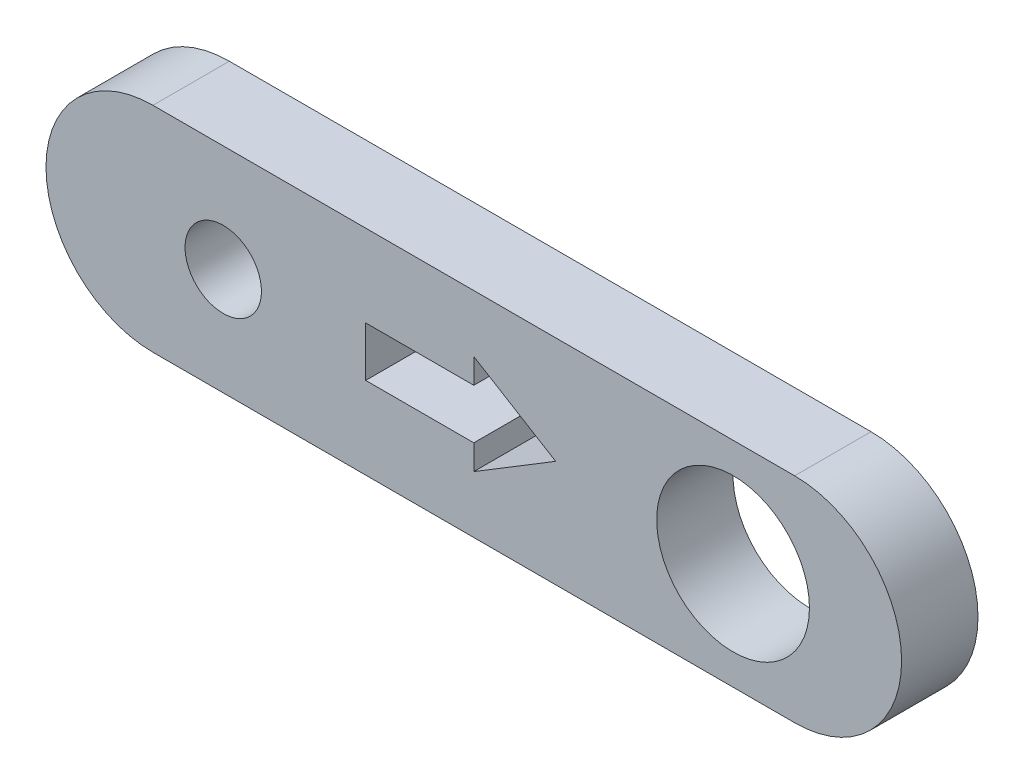
ISO-10303-21;
HEADER;
FILE_DESCRIPTION(('STEP AP214'),'2;1');
FILE_NAME('part.step','',(''),(''),'','','');
FILE_SCHEMA(('AUTOMOTIVE_DESIGN { 1 0 10303 214 1 1 1 1 }'));
ENDSEC;
DATA;
#1=APPLICATION_CONTEXT('core data for automotive mechanical design processes');
#2=APPLICATION_PROTOCOL_DEFINITION('international standard','automotive_design',2000,#1);
#3=PRODUCT_CONTEXT('',#1,'mechanical');
#4=PRODUCT('Part','Part','',(#3));
#5=PRODUCT_RELATED_PRODUCT_CATEGORY('part','',(#4));
#6=PRODUCT_DEFINITION_FORMATION('','',#4);
#7=PRODUCT_DEFINITION_CONTEXT('part definition',#1,'design');
#8=PRODUCT_DEFINITION('design','',#6,#7);
#9=PRODUCT_DEFINITION_SHAPE('','',#8);
#10=(LENGTH_UNIT() NAMED_UNIT(*) SI_UNIT(.MILLI.,.METRE.));
#11=(NAMED_UNIT(*) PLANE_ANGLE_UNIT() SI_UNIT($,.RADIAN.));
#12=(NAMED_UNIT(*) SI_UNIT($,.STERADIAN.) SOLID_ANGLE_UNIT());
#13=UNCERTAINTY_MEASURE_WITH_UNIT(LENGTH_MEASURE(1.E-05),#10,'distance_accuracy_value','');
#14=(GEOMETRIC_REPRESENTATION_CONTEXT(3) GLOBAL_UNCERTAINTY_ASSIGNED_CONTEXT((#13)) GLOBAL_UNIT_ASSIGNED_CONTEXT((#10,
#11,#12)) REPRESENTATION_CONTEXT('',''));
#15=CARTESIAN_POINT('',(0.,0.,0.));
#16=DIRECTION('',(0.,0.,1.));
#17=DIRECTION('',(1.,0.,0.));
#18=AXIS2_PLACEMENT_3D('',#15,#16,#17);
#19=CARTESIAN_POINT('',(0.,7.,5.));
#20=DIRECTION('',(0.,-1.,0.));
#21=DIRECTION('',(1.,0.,0.));
#22=AXIS2_PLACEMENT_3D('',#19,#20,#21);
#23=PLANE('',#22);
#24=DIRECTION('',(-1.,0.,0.));
#25=VECTOR('',#24,1.);
#26=CARTESIAN_POINT('',(0.,7.,0.));
#27=LINE('',#26,#25);
#28=CARTESIAN_POINT('',(0.,7.,0.));
#29=VERTEX_POINT('',#28);
#30=CARTESIAN_POINT('',(-42.,7.00000000000001,0.));
#31=VERTEX_POINT('',#30);
#32=EDGE_CURVE('E171',#29,#31,#27,.T.);
#33=ORIENTED_EDGE('',*,*,#32,.T.);
#34=DIRECTION('',(0.,0.,-1.));
#35=VECTOR('',#34,1.);
#36=CARTESIAN_POINT('',(-42.,7.00000000000001,5.));
#37=LINE('',#36,#35);
#38=CARTESIAN_POINT('',(-42.,7.00000000000001,5.));
#39=VERTEX_POINT('',#38);
#40=EDGE_CURVE('E11',#39,#31,#37,.T.);
#41=ORIENTED_EDGE('',*,*,#40,.F.);
#42=DIRECTION('',(-1.,0.,0.));
#43=VECTOR('',#42,1.);
#44=CARTESIAN_POINT('',(0.,7.,5.));
#45=LINE('',#44,#43);
#46=CARTESIAN_POINT('',(0.,7.,5.));
#47=VERTEX_POINT('',#46);
#48=EDGE_CURVE('E129',#47,#39,#45,.T.);
#49=ORIENTED_EDGE('',*,*,#48,.F.);
#50=DIRECTION('',(0.,0.,-1.));
#51=VECTOR('',#50,1.);
#52=CARTESIAN_POINT('',(0.,7.,5.));
#53=LINE('',#52,#51);
#54=EDGE_CURVE('E179',#47,#29,#53,.T.);
#55=ORIENTED_EDGE('',*,*,#54,.T.);
#56=EDGE_LOOP('',(#33,#41,#49,#55));
#57=FACE_BOUND('',#56,.T.);
#58=ADVANCED_FACE('F34',(#57),#23,.F.);
#59=CARTESIAN_POINT('',(-42.,0.,5.));
#60=DIRECTION('',(0.,0.,-1.));
#61=DIRECTION('',(-1.,0.,0.));
#62=AXIS2_PLACEMENT_3D('',#59,#60,#61);
#63=CYLINDRICAL_SURFACE('',#62,7.);
#64=CARTESIAN_POINT('',(-42.,0.,0.));
#65=DIRECTION('',(0.,0.,1.));
#66=DIRECTION('',(1.,0.,0.));
#67=AXIS2_PLACEMENT_3D('',#64,#65,#66);
#68=CIRCLE('',#67,7.);
#69=CARTESIAN_POINT('',(-42.,-6.99999999999999,0.));
#70=VERTEX_POINT('',#69);
#71=EDGE_CURVE('E135',#31,#70,#68,.T.);
#72=ORIENTED_EDGE('',*,*,#71,.T.);
#73=DIRECTION('',(0.,0.,-1.));
#74=VECTOR('',#73,1.);
#75=CARTESIAN_POINT('',(-42.,-6.99999999999999,5.));
#76=LINE('',#75,#74);
#77=CARTESIAN_POINT('',(-42.,-6.99999999999999,5.));
#78=VERTEX_POINT('',#77);
#79=EDGE_CURVE('E44',#78,#70,#76,.T.);
#80=ORIENTED_EDGE('',*,*,#79,.F.);
#81=CARTESIAN_POINT('',(-42.,0.,5.));
#82=DIRECTION('',(0.,0.,1.));
#83=DIRECTION('',(1.,0.,0.));
#84=AXIS2_PLACEMENT_3D('',#81,#82,#83);
#85=CIRCLE('',#84,7.);
#86=EDGE_CURVE('E123',#39,#78,#85,.T.);
#87=ORIENTED_EDGE('',*,*,#86,.F.);
#88=ORIENTED_EDGE('',*,*,#40,.T.);
#89=EDGE_LOOP('',(#72,#80,#87,#88));
#90=FACE_BOUND('',#89,.T.);
#91=ADVANCED_FACE('F134',(#90),#63,.T.);
#92=CARTESIAN_POINT('',(0.,-7.,5.));
#93=DIRECTION('',(0.,-1.,0.));
#94=DIRECTION('',(1.,0.,0.));
#95=AXIS2_PLACEMENT_3D('',#92,#93,#94);
#96=PLANE('',#95);
#97=DIRECTION('',(-1.,0.,0.));
#98=VECTOR('',#97,1.);
#99=CARTESIAN_POINT('',(0.,-7.,0.));
#100=LINE('',#99,#98);
#101=CARTESIAN_POINT('',(0.,-7.,0.));
#102=VERTEX_POINT('',#101);
#103=EDGE_CURVE('E175',#102,#70,#100,.T.);
#104=ORIENTED_EDGE('',*,*,#103,.F.);
#105=DIRECTION('',(0.,0.,-1.));
#106=VECTOR('',#105,1.);
#107=CARTESIAN_POINT('',(0.,-7.,5.));
#108=LINE('',#107,#106);
#109=CARTESIAN_POINT('',(0.,-7.,5.));
#110=VERTEX_POINT('',#109);
#111=EDGE_CURVE('E90',#110,#102,#108,.T.);
#112=ORIENTED_EDGE('',*,*,#111,.F.);
#113=DIRECTION('',(-1.,0.,0.));
#114=VECTOR('',#113,1.);
#115=CARTESIAN_POINT('',(0.,-7.,5.));
#116=LINE('',#115,#114);
#117=EDGE_CURVE('E127',#110,#78,#116,.T.);
#118=ORIENTED_EDGE('',*,*,#117,.T.);
#119=ORIENTED_EDGE('',*,*,#79,.T.);
#120=EDGE_LOOP('',(#104,#112,#118,#119));
#121=FACE_BOUND('',#120,.T.);
#122=ADVANCED_FACE('F140',(#121),#96,.T.);
#123=CARTESIAN_POINT('',(-28.0744883601406,0.,5.));
#124=DIRECTION('',(1.,0.,0.));
#125=DIRECTION('',(0.,0.,-1.));
#126=AXIS2_PLACEMENT_3D('',#123,#124,#125);
#127=PLANE('',#126);
#128=DIRECTION('',(0.,-1.,0.));
#129=VECTOR('',#128,1.);
#130=CARTESIAN_POINT('',(-28.0744883601406,0.,0.));
#131=LINE('',#130,#129);
#132=CARTESIAN_POINT('',(-28.0744883601406,1.63000687857731,0.));
#133=VERTEX_POINT('',#132);
#134=CARTESIAN_POINT('',(-28.0744883601406,-1.63000687857731,0.));
#135=VERTEX_POINT('',#134);
#136=EDGE_CURVE('E152',#133,#135,#131,.T.);
#137=ORIENTED_EDGE('',*,*,#136,.F.);
#138=DIRECTION('',(0.,0.,-1.));
#139=VECTOR('',#138,1.);
#140=CARTESIAN_POINT('',(-28.0744883601406,1.63000687857731,5.));
#141=LINE('',#140,#139);
#142=CARTESIAN_POINT('',(-28.0744883601406,1.63000687857731,5.));
#143=VERTEX_POINT('',#142);
#144=EDGE_CURVE('E38',#143,#133,#141,.T.);
#145=ORIENTED_EDGE('',*,*,#144,.F.);
#146=DIRECTION('',(0.,-1.,0.));
#147=VECTOR('',#146,1.);
#148=CARTESIAN_POINT('',(-28.0744883601406,0.,5.));
#149=LINE('',#148,#147);
#150=CARTESIAN_POINT('',(-28.0744883601406,-1.63000687857731,5.));
#151=VERTEX_POINT('',#150);
#152=EDGE_CURVE('E238',#143,#151,#149,.T.);
#153=ORIENTED_EDGE('',*,*,#152,.T.);
#154=DIRECTION('',(0.,0.,-1.));
#155=VECTOR('',#154,1.);
#156=CARTESIAN_POINT('',(-28.0744883601406,-1.63000687857731,5.));
#157=LINE('',#156,#155);
#158=EDGE_CURVE('E142',#151,#135,#157,.T.);
#159=ORIENTED_EDGE('',*,*,#158,.T.);
#160=EDGE_LOOP('',(#137,#145,#153,#159));
#161=FACE_BOUND('',#160,.T.);
#162=ADVANCED_FACE('F200',(#161),#127,.T.);
#163=CARTESIAN_POINT('',(0.,1.63000687857731,5.));
#164=DIRECTION('',(0.,-1.,0.));
#165=DIRECTION('',(0.,0.,-1.));
#166=AXIS2_PLACEMENT_3D('',#163,#164,#165);
#167=PLANE('',#166);
#168=DIRECTION('',(-1.,0.,0.));
#169=VECTOR('',#168,1.);
#170=CARTESIAN_POINT('',(0.,1.63000687857731,0.));
#171=LINE('',#170,#169);
#172=CARTESIAN_POINT('',(-21.,1.63000687857731,0.));
#173=VERTEX_POINT('',#172);
#174=EDGE_CURVE('E155',#173,#133,#171,.T.);
#175=ORIENTED_EDGE('',*,*,#174,.F.);
#176=DIRECTION('',(0.,0.,-1.));
#177=VECTOR('',#176,1.);
#178=CARTESIAN_POINT('',(-21.,1.63000687857731,5.));
#179=LINE('',#178,#177);
#180=CARTESIAN_POINT('',(-21.,1.63000687857731,5.));
#181=VERTEX_POINT('',#180);
#182=EDGE_CURVE('E190',#181,#173,#179,.T.);
#183=ORIENTED_EDGE('',*,*,#182,.F.);
#184=DIRECTION('',(-1.,0.,0.));
#185=VECTOR('',#184,1.);
#186=CARTESIAN_POINT('',(0.,1.63000687857731,5.));
#187=LINE('',#186,#185);
#188=EDGE_CURVE('E199',#181,#143,#187,.T.);
#189=ORIENTED_EDGE('',*,*,#188,.T.);
#190=ORIENTED_EDGE('',*,*,#144,.T.);
#191=EDGE_LOOP('',(#175,#183,#189,#190));
#192=FACE_BOUND('',#191,.T.);
#193=ADVANCED_FACE('F197',(#192),#167,.T.);
#194=CARTESIAN_POINT('',(-21.,0.,5.));
#195=DIRECTION('',(1.,0.,0.));
#196=DIRECTION('',(0.,0.,-1.));
#197=AXIS2_PLACEMENT_3D('',#194,#195,#196);
#198=PLANE('',#197);
#199=DIRECTION('',(0.,-1.,0.));
#200=VECTOR('',#199,1.);
#201=CARTESIAN_POINT('',(-21.,0.,0.));
#202=LINE('',#201,#200);
#203=CARTESIAN_POINT('',(-21.,3.26001375715463,0.));
#204=VERTEX_POINT('',#203);
#205=EDGE_CURVE('E158',#204,#173,#202,.T.);
#206=ORIENTED_EDGE('',*,*,#205,.F.);
#207=DIRECTION('',(0.,0.,-1.));
#208=VECTOR('',#207,1.);
#209=CARTESIAN_POINT('',(-21.,3.26001375715463,5.));
#210=LINE('',#209,#208);
#211=CARTESIAN_POINT('',(-21.,3.26001375715463,5.));
#212=VERTEX_POINT('',#211);
#213=EDGE_CURVE('E189',#212,#204,#210,.T.);
#214=ORIENTED_EDGE('',*,*,#213,.F.);
#215=DIRECTION('',(0.,-1.,0.));
#216=VECTOR('',#215,1.);
#217=CARTESIAN_POINT('',(-21.,0.,5.));
#218=LINE('',#217,#216);
#219=EDGE_CURVE('E210',#212,#181,#218,.T.);
#220=ORIENTED_EDGE('',*,*,#219,.T.);
#221=ORIENTED_EDGE('',*,*,#182,.T.);
#222=EDGE_LOOP('',(#206,#214,#220,#221));
#223=FACE_BOUND('',#222,.T.);
#224=ADVANCED_FACE('F208',(#223),#198,.T.);
#225=CARTESIAN_POINT('',(-4.22547620732134,-6.94538078608944,5.));
#226=DIRECTION('',(-0.519754248716945,-0.854315820373639,0.));
#227=DIRECTION('',(0.854315820373639,-0.519754248716945,0.));
#228=AXIS2_PLACEMENT_3D('',#225,#226,#227);
#229=PLANE('',#228);
#230=DIRECTION('',(-0.854315820373639,0.519754248716945,0.));
#231=VECTOR('',#230,1.);
#232=CARTESIAN_POINT('',(-4.22547620732134,-6.94538078608944,0.));
#233=LINE('',#232,#231);
#234=CARTESIAN_POINT('',(-15.6415419705599,0.,0.));
#235=VERTEX_POINT('',#234);
#236=EDGE_CURVE('E161',#235,#204,#233,.T.);
#237=ORIENTED_EDGE('',*,*,#236,.F.);
#238=DIRECTION('',(0.,0.,-1.));
#239=VECTOR('',#238,1.);
#240=CARTESIAN_POINT('',(-15.6415419705599,0.,5.));
#241=LINE('',#240,#239);
#242=CARTESIAN_POINT('',(-15.6415419705599,0.,5.));
#243=VERTEX_POINT('',#242);
#244=EDGE_CURVE('E187',#243,#235,#241,.T.);
#245=ORIENTED_EDGE('',*,*,#244,.F.);
#246=DIRECTION('',(-0.854315820373639,0.519754248716945,0.));
#247=VECTOR('',#246,1.);
#248=CARTESIAN_POINT('',(-4.22547620732134,-6.94538078608944,5.));
#249=LINE('',#248,#247);
#250=EDGE_CURVE('E215',#243,#212,#249,.T.);
#251=ORIENTED_EDGE('',*,*,#250,.T.);
#252=ORIENTED_EDGE('',*,*,#213,.T.);
#253=EDGE_LOOP('',(#237,#245,#251,#252));
#254=FACE_BOUND('',#253,.T.);
#255=ADVANCED_FACE('F218',(#254),#229,.T.);
#256=CARTESIAN_POINT('',(-4.22547620732134,6.94538078608944,5.));
#257=DIRECTION('',(0.519754248716945,-0.854315820373639,0.));
#258=DIRECTION('',(0.854315820373639,0.519754248716945,0.));
#259=AXIS2_PLACEMENT_3D('',#256,#257,#258);
#260=PLANE('',#259);
#261=DIRECTION('',(-0.854315820373639,-0.519754248716945,0.));
#262=VECTOR('',#261,1.);
#263=CARTESIAN_POINT('',(-4.22547620732134,6.94538078608944,0.));
#264=LINE('',#263,#262);
#265=CARTESIAN_POINT('',(-21.,-3.26001375715463,0.));
#266=VERTEX_POINT('',#265);
#267=EDGE_CURVE('E165',#235,#266,#264,.T.);
#268=ORIENTED_EDGE('',*,*,#267,.T.);
#269=DIRECTION('',(0.,0.,-1.));
#270=VECTOR('',#269,1.);
#271=CARTESIAN_POINT('',(-21.,-3.26001375715463,5.));
#272=LINE('',#271,#270);
#273=CARTESIAN_POINT('',(-21.,-3.26001375715463,5.));
#274=VERTEX_POINT('',#273);
#275=EDGE_CURVE('E185',#274,#266,#272,.T.);
#276=ORIENTED_EDGE('',*,*,#275,.F.);
#277=DIRECTION('',(-0.854315820373639,-0.519754248716945,0.));
#278=VECTOR('',#277,1.);
#279=CARTESIAN_POINT('',(-4.22547620732134,6.94538078608944,5.));
#280=LINE('',#279,#278);
#281=EDGE_CURVE('E220',#243,#274,#280,.T.);
#282=ORIENTED_EDGE('',*,*,#281,.F.);
#283=ORIENTED_EDGE('',*,*,#244,.T.);
#284=EDGE_LOOP('',(#268,#276,#282,#283));
#285=FACE_BOUND('',#284,.T.);
#286=ADVANCED_FACE('F234',(#285),#260,.F.);
#287=CARTESIAN_POINT('',(-21.,-1.63000687857731,0.));
#288=VERTEX_POINT('',#287);
#289=EDGE_CURVE('E162',#288,#266,#202,.T.);
#290=ORIENTED_EDGE('',*,*,#289,.F.);
#291=DIRECTION('',(0.,0.,-1.));
#292=VECTOR('',#291,1.);
#293=CARTESIAN_POINT('',(-21.,-1.63000687857731,5.));
#294=LINE('',#293,#292);
#295=CARTESIAN_POINT('',(-21.,-1.63000687857731,5.));
#296=VERTEX_POINT('',#295);
#297=EDGE_CURVE('E183',#296,#288,#294,.T.);
#298=ORIENTED_EDGE('',*,*,#297,.F.);
#299=EDGE_CURVE('E217',#296,#274,#218,.T.);
#300=ORIENTED_EDGE('',*,*,#299,.T.);
#301=ORIENTED_EDGE('',*,*,#275,.T.);
#302=EDGE_LOOP('',(#290,#298,#300,#301));
#303=FACE_BOUND('',#302,.T.);
#304=ADVANCED_FACE('F231',(#303),#198,.T.);
#305=CARTESIAN_POINT('',(0.,-1.63000687857731,5.));
#306=DIRECTION('',(0.,-1.,0.));
#307=DIRECTION('',(0.,0.,-1.));
#308=AXIS2_PLACEMENT_3D('',#305,#306,#307);
#309=PLANE('',#308);
#310=DIRECTION('',(-1.,0.,0.));
#311=VECTOR('',#310,1.);
#312=CARTESIAN_POINT('',(0.,-1.63000687857731,0.));
#313=LINE('',#312,#311);
#314=EDGE_CURVE('E168',#288,#135,#313,.T.);
#315=ORIENTED_EDGE('',*,*,#314,.T.);
#316=ORIENTED_EDGE('',*,*,#158,.F.);
#317=DIRECTION('',(-1.,0.,0.));
#318=VECTOR('',#317,1.);
#319=CARTESIAN_POINT('',(0.,-1.63000687857731,5.));
#320=LINE('',#319,#318);
#321=EDGE_CURVE('E225',#296,#151,#320,.T.);
#322=ORIENTED_EDGE('',*,*,#321,.F.);
#323=ORIENTED_EDGE('',*,*,#297,.T.);
#324=EDGE_LOOP('',(#315,#316,#322,#323));
#325=FACE_BOUND('',#324,.T.);
#326=ADVANCED_FACE('F237',(#325),#309,.F.);
#327=CARTESIAN_POINT('',(-37.3991981523261,0.,5.));
#328=DIRECTION('',(0.,0.,-1.));
#329=DIRECTION('',(-1.,0.,0.));
#330=AXIS2_PLACEMENT_3D('',#327,#328,#329);
#331=CYLINDRICAL_SURFACE('',#330,2.5);
#332=CARTESIAN_POINT('',(-37.3991981523261,0.,5.));
#333=DIRECTION('',(0.,0.,1.));
#334=DIRECTION('',(1.,0.,0.));
#335=AXIS2_PLACEMENT_3D('',#332,#333,#334);
#336=CIRCLE('',#335,2.5);
#337=CARTESIAN_POINT('',(-34.8991981523261,0.,5.));
#338=VERTEX_POINT('',#337);
#339=EDGE_CURVE('E239',#338,#338,#336,.T.);
#340=ORIENTED_EDGE('',*,*,#339,.T.);
#341=EDGE_LOOP('',(#340));
#342=FACE_BOUND('',#341,.T.);
#343=CARTESIAN_POINT('',(-37.3991981523261,0.,0.));
#344=DIRECTION('',(0.,0.,1.));
#345=DIRECTION('',(1.,0.,0.));
#346=AXIS2_PLACEMENT_3D('',#343,#344,#345);
#347=CIRCLE('',#346,2.5);
#348=CARTESIAN_POINT('',(-34.8991981523261,0.,0.));
#349=VERTEX_POINT('',#348);
#350=EDGE_CURVE('E149',#349,#349,#347,.T.);
#351=ORIENTED_EDGE('',*,*,#350,.F.);
#352=EDGE_LOOP('',(#351));
#353=FACE_BOUND('',#352,.T.);
#354=ADVANCED_FACE('F255',(#342,#353),#331,.F.);
#355=CARTESIAN_POINT('',(-4.03136409205443,0.,5.));
#356=DIRECTION('',(0.,0.,-1.));
#357=DIRECTION('',(-1.,0.,0.));
#358=AXIS2_PLACEMENT_3D('',#355,#356,#357);
#359=CYLINDRICAL_SURFACE('',#358,5.);
#360=CARTESIAN_POINT('',(-4.03136409205443,0.,5.));
#361=DIRECTION('',(0.,0.,1.));
#362=DIRECTION('',(1.,0.,0.));
#363=AXIS2_PLACEMENT_3D('',#360,#361,#362);
#364=CIRCLE('',#363,5.);
#365=CARTESIAN_POINT('',(0.968635907945573,0.,5.));
#366=VERTEX_POINT('',#365);
#367=EDGE_CURVE('E178',#366,#366,#364,.T.);
#368=ORIENTED_EDGE('',*,*,#367,.T.);
#369=EDGE_LOOP('',(#368));
#370=FACE_BOUND('',#369,.T.);
#371=CARTESIAN_POINT('',(-4.03136409205443,0.,0.));
#372=DIRECTION('',(0.,0.,1.));
#373=DIRECTION('',(1.,0.,0.));
#374=AXIS2_PLACEMENT_3D('',#371,#372,#373);
#375=CIRCLE('',#374,5.);
#376=CARTESIAN_POINT('',(0.968635907945573,0.,0.));
#377=VERTEX_POINT('',#376);
#378=EDGE_CURVE('E146',#377,#377,#375,.T.);
#379=ORIENTED_EDGE('',*,*,#378,.F.);
#380=EDGE_LOOP('',(#379));
#381=FACE_BOUND('',#380,.T.);
#382=ADVANCED_FACE('F36',(#370,#381),#359,.F.);
#383=CARTESIAN_POINT('',(0.,0.,5.));
#384=DIRECTION('',(0.,0.,-1.));
#385=DIRECTION('',(-1.,0.,0.));
#386=AXIS2_PLACEMENT_3D('',#383,#384,#385);
#387=CYLINDRICAL_SURFACE('',#386,7.);
#388=CARTESIAN_POINT('',(0.,0.,0.));
#389=DIRECTION('',(0.,0.,1.));
#390=DIRECTION('',(1.,0.,0.));
#391=AXIS2_PLACEMENT_3D('',#388,#389,#390);
#392=CIRCLE('',#391,7.);
#393=EDGE_CURVE('E93',#102,#29,#392,.T.);
#394=ORIENTED_EDGE('',*,*,#393,.T.);
#395=ORIENTED_EDGE('',*,*,#54,.F.);
#396=CARTESIAN_POINT('',(0.,0.,5.));
#397=DIRECTION('',(0.,0.,1.));
#398=DIRECTION('',(1.,0.,0.));
#399=AXIS2_PLACEMENT_3D('',#396,#397,#398);
#400=CIRCLE('',#399,7.);
#401=EDGE_CURVE('E53',#110,#47,#400,.T.);
#402=ORIENTED_EDGE('',*,*,#401,.F.);
#403=ORIENTED_EDGE('',*,*,#111,.T.);
#404=EDGE_LOOP('',(#394,#395,#402,#403));
#405=FACE_BOUND('',#404,.T.);
#406=ADVANCED_FACE('F251',(#405),#387,.T.);
#407=CARTESIAN_POINT('',(0.,0.,5.));
#408=DIRECTION('',(0.,0.,1.));
#409=DIRECTION('',(1.,0.,0.));
#410=AXIS2_PLACEMENT_3D('',#407,#408,#409);
#411=PLANE('',#410);
#412=ORIENTED_EDGE('',*,*,#367,.F.);
#413=EDGE_LOOP('',(#412));
#414=FACE_BOUND('',#413,.T.);
#415=ORIENTED_EDGE('',*,*,#339,.F.);
#416=EDGE_LOOP('',(#415));
#417=FACE_BOUND('',#416,.T.);
#418=ORIENTED_EDGE('',*,*,#152,.F.);
#419=ORIENTED_EDGE('',*,*,#188,.F.);
#420=ORIENTED_EDGE('',*,*,#219,.F.);
#421=ORIENTED_EDGE('',*,*,#250,.F.);
#422=ORIENTED_EDGE('',*,*,#281,.T.);
#423=ORIENTED_EDGE('',*,*,#299,.F.);
#424=ORIENTED_EDGE('',*,*,#321,.T.);
#425=EDGE_LOOP('',(#418,#419,#420,#421,#422,#423,#424));
#426=FACE_BOUND('',#425,.T.);
#427=ORIENTED_EDGE('',*,*,#48,.T.);
#428=ORIENTED_EDGE('',*,*,#86,.T.);
#429=ORIENTED_EDGE('',*,*,#117,.F.);
#430=ORIENTED_EDGE('',*,*,#401,.T.);
#431=EDGE_LOOP('',(#427,#428,#429,#430));
#432=FACE_BOUND('',#431,.T.);
#433=ADVANCED_FACE('F125',(#414,#417,#426,#432),#411,.T.);
#434=CARTESIAN_POINT('',(0.,0.,0.));
#435=DIRECTION('',(0.,0.,1.));
#436=DIRECTION('',(1.,0.,0.));
#437=AXIS2_PLACEMENT_3D('',#434,#435,#436);
#438=PLANE('',#437);
#439=ORIENTED_EDGE('',*,*,#378,.T.);
#440=EDGE_LOOP('',(#439));
#441=FACE_BOUND('',#440,.T.);
#442=ORIENTED_EDGE('',*,*,#350,.T.);
#443=EDGE_LOOP('',(#442));
#444=FACE_BOUND('',#443,.T.);
#445=ORIENTED_EDGE('',*,*,#136,.T.);
#446=ORIENTED_EDGE('',*,*,#314,.F.);
#447=ORIENTED_EDGE('',*,*,#289,.T.);
#448=ORIENTED_EDGE('',*,*,#267,.F.);
#449=ORIENTED_EDGE('',*,*,#236,.T.);
#450=ORIENTED_EDGE('',*,*,#205,.T.);
#451=ORIENTED_EDGE('',*,*,#174,.T.);
#452=EDGE_LOOP('',(#445,#446,#447,#448,#449,#450,#451));
#453=FACE_BOUND('',#452,.T.);
#454=ORIENTED_EDGE('',*,*,#32,.F.);
#455=ORIENTED_EDGE('',*,*,#393,.F.);
#456=ORIENTED_EDGE('',*,*,#103,.T.);
#457=ORIENTED_EDGE('',*,*,#71,.F.);
#458=EDGE_LOOP('',(#454,#455,#456,#457));
#459=FACE_BOUND('',#458,.T.);
#460=ADVANCED_FACE('F204',(#441,#444,#453,#459),#438,.F.);
#461=CLOSED_SHELL('',(#58,#91,#122,#162,#193,#224,#255,#286,#304,#326,#354,#382,#406,#433,#460));
#462=MANIFOLD_SOLID_BREP('B2',#461);
#463=ADVANCED_BREP_SHAPE_REPRESENTATION('',(#18,#462),#14);
#464=SHAPE_DEFINITION_REPRESENTATION(#9,#463);
ENDSEC;
END-ISO-10303-21;
